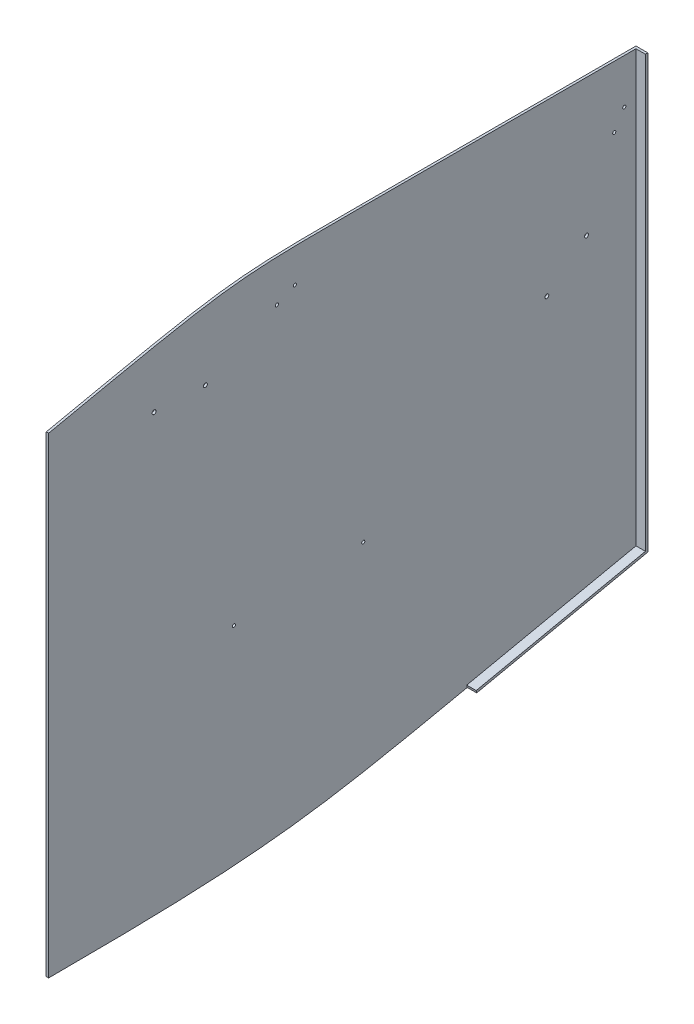
ISO-10303-21;
HEADER;
FILE_DESCRIPTION(('STEP AP214'),'2;1');
FILE_NAME('part.step','',(''),(''),'','','');
FILE_SCHEMA(('AUTOMOTIVE_DESIGN { 1 0 10303 214 1 1 1 1 }'));
ENDSEC;
DATA;
#1=APPLICATION_CONTEXT('core data for automotive mechanical design processes');
#2=APPLICATION_PROTOCOL_DEFINITION('international standard','automotive_design',2000,#1);
#3=PRODUCT_CONTEXT('',#1,'mechanical');
#4=PRODUCT('Part','Part','',(#3));
#5=PRODUCT_RELATED_PRODUCT_CATEGORY('part','',(#4));
#6=PRODUCT_DEFINITION_FORMATION('','',#4);
#7=PRODUCT_DEFINITION_CONTEXT('part definition',#1,'design');
#8=PRODUCT_DEFINITION('design','',#6,#7);
#9=PRODUCT_DEFINITION_SHAPE('','',#8);
#10=(LENGTH_UNIT() NAMED_UNIT(*) SI_UNIT(.MILLI.,.METRE.));
#11=(NAMED_UNIT(*) PLANE_ANGLE_UNIT() SI_UNIT($,.RADIAN.));
#12=(NAMED_UNIT(*) SI_UNIT($,.STERADIAN.) SOLID_ANGLE_UNIT());
#13=UNCERTAINTY_MEASURE_WITH_UNIT(LENGTH_MEASURE(1.E-05),#10,'distance_accuracy_value','');
#14=(GEOMETRIC_REPRESENTATION_CONTEXT(3) GLOBAL_UNCERTAINTY_ASSIGNED_CONTEXT((#13)) GLOBAL_UNIT_ASSIGNED_CONTEXT((#10,
#11,#12)) REPRESENTATION_CONTEXT('',''));
#15=CARTESIAN_POINT('',(0.,0.,0.));
#16=DIRECTION('',(0.,0.,1.));
#17=DIRECTION('',(1.,0.,0.));
#18=AXIS2_PLACEMENT_3D('',#15,#16,#17);
#19=CARTESIAN_POINT('',(0.,319.838635526176,150.465133654487));
#20=DIRECTION('',(-1.,0.,0.));
#21=DIRECTION('',(0.,0.,1.));
#22=AXIS2_PLACEMENT_3D('',#19,#20,#21);
#23=PLANE('',#22);
#24=CARTESIAN_POINT('',(0.,232.178083694992,240.980976375255));
#25=DIRECTION('',(-1.,0.,0.));
#26=DIRECTION('',(0.,0.,1.));
#27=AXIS2_PLACEMENT_3D('',#24,#25,#26);
#28=CIRCLE('',#27,2.49999999999993);
#29=CARTESIAN_POINT('',(0.,232.178083694992,243.480976375255));
#30=VERTEX_POINT('',#29);
#31=EDGE_CURVE('E222',#30,#30,#28,.T.);
#32=ORIENTED_EDGE('',*,*,#31,.T.);
#33=EDGE_LOOP('',(#32));
#34=FACE_BOUND('',#33,.T.);
#35=CARTESIAN_POINT('',(0.,151.668432326628,-309.057260955756));
#36=DIRECTION('',(-1.,0.,0.));
#37=DIRECTION('',(0.,0.,1.));
#38=AXIS2_PLACEMENT_3D('',#35,#36,#37);
#39=CIRCLE('',#38,2.49999999999996);
#40=CARTESIAN_POINT('',(0.,151.668432326628,-306.557260955756));
#41=VERTEX_POINT('',#40);
#42=EDGE_CURVE('E306',#41,#41,#39,.T.);
#43=ORIENTED_EDGE('',*,*,#42,.T.);
#44=EDGE_LOOP('',(#43));
#45=FACE_BOUND('',#44,.T.);
#46=CARTESIAN_POINT('',(0.,247.678292182664,-344.33236996464));
#47=DIRECTION('',(-1.,0.,0.));
#48=DIRECTION('',(0.,0.,1.));
#49=AXIS2_PLACEMENT_3D('',#46,#47,#48);
#50=CIRCLE('',#49,2.);
#51=CARTESIAN_POINT('',(0.,247.678292182664,-342.33236996464));
#52=VERTEX_POINT('',#51);
#53=EDGE_CURVE('E303',#52,#52,#50,.T.);
#54=ORIENTED_EDGE('',*,*,#53,.T.);
#55=EDGE_LOOP('',(#54));
#56=FACE_BOUND('',#55,.T.);
#57=CARTESIAN_POINT('',(0.,269.230000887089,-357.015369170463));
#58=DIRECTION('',(-1.,0.,0.));
#59=DIRECTION('',(0.,0.,1.));
#60=AXIS2_PLACEMENT_3D('',#57,#58,#59);
#61=CIRCLE('',#60,2.);
#62=CARTESIAN_POINT('',(0.,269.230000887089,-355.015369170463));
#63=VERTEX_POINT('',#62);
#64=EDGE_CURVE('E294',#63,#63,#61,.T.);
#65=ORIENTED_EDGE('',*,*,#64,.T.);
#66=EDGE_LOOP('',(#65));
#67=FACE_BOUND('',#66,.T.);
#68=CARTESIAN_POINT('',(0.,-53.6769549320207,139.344950951392));
#69=DIRECTION('',(-1.,0.,0.));
#70=DIRECTION('',(0.,0.,1.));
#71=AXIS2_PLACEMENT_3D('',#68,#69,#70);
#72=CIRCLE('',#71,2.);
#73=CARTESIAN_POINT('',(0.,-53.6769549320207,141.344950951392));
#74=VERTEX_POINT('',#73);
#75=EDGE_CURVE('E290',#74,#74,#72,.T.);
#76=ORIENTED_EDGE('',*,*,#75,.T.);
#77=EDGE_LOOP('',(#76));
#78=FACE_BOUND('',#77,.T.);
#79=CARTESIAN_POINT('',(0.,110.126241652456,-258.59120412079));
#80=DIRECTION('',(-1.,0.,0.));
#81=DIRECTION('',(0.,0.,1.));
#82=AXIS2_PLACEMENT_3D('',#79,#80,#81);
#83=CIRCLE('',#82,2.49999999999985);
#84=CARTESIAN_POINT('',(0.,110.126241652456,-256.09120412079));
#85=VERTEX_POINT('',#84);
#86=EDGE_CURVE('E288',#85,#85,#83,.T.);
#87=ORIENTED_EDGE('',*,*,#86,.T.);
#88=EDGE_LOOP('',(#87));
#89=FACE_BOUND('',#88,.T.);
#90=CARTESIAN_POINT('',(0.,282.615467422992,61.9187014503996));
#91=DIRECTION('',(-1.,0.,0.));
#92=DIRECTION('',(0.,0.,1.));
#93=AXIS2_PLACEMENT_3D('',#90,#91,#92);
#94=CIRCLE('',#93,2.);
#95=CARTESIAN_POINT('',(0.,282.615467422992,63.9187014503996));
#96=VERTEX_POINT('',#95);
#97=EDGE_CURVE('E291',#96,#96,#94,.T.);
#98=ORIENTED_EDGE('',*,*,#97,.T.);
#99=EDGE_LOOP('',(#98));
#100=FACE_BOUND('',#99,.T.);
#101=CARTESIAN_POINT('',(0.,272.236010662539,84.6695584516908));
#102=DIRECTION('',(-1.,0.,0.));
#103=DIRECTION('',(0.,0.,1.));
#104=AXIS2_PLACEMENT_3D('',#101,#102,#103);
#105=CIRCLE('',#104,2.);
#106=CARTESIAN_POINT('',(0.,272.236010662539,86.6695584516908));
#107=VERTEX_POINT('',#106);
#108=EDGE_CURVE('E297',#107,#107,#105,.T.);
#109=ORIENTED_EDGE('',*,*,#108,.T.);
#110=EDGE_LOOP('',(#109));
#111=FACE_BOUND('',#110,.T.);
#112=CARTESIAN_POINT('',(0.,229.281564523231,175.680236140806));
#113=DIRECTION('',(-1.,0.,0.));
#114=DIRECTION('',(0.,0.,1.));
#115=AXIS2_PLACEMENT_3D('',#112,#113,#114);
#116=CIRCLE('',#115,2.49999999999993);
#117=CARTESIAN_POINT('',(0.,229.281564523231,178.180236140806));
#118=VERTEX_POINT('',#117);
#119=EDGE_CURVE('E328',#118,#118,#116,.T.);
#120=ORIENTED_EDGE('',*,*,#119,.T.);
#121=EDGE_LOOP('',(#120));
#122=FACE_BOUND('',#121,.T.);
#123=CARTESIAN_POINT('',(0.,-44.0173953899926,-25.083553444382));
#124=DIRECTION('',(-1.,0.,0.));
#125=DIRECTION('',(0.,0.,1.));
#126=AXIS2_PLACEMENT_3D('',#123,#124,#125);
#127=CIRCLE('',#126,2.);
#128=CARTESIAN_POINT('',(0.,-44.0173953899926,-23.083553444382));
#129=VERTEX_POINT('',#128);
#130=EDGE_CURVE('E331',#129,#129,#127,.T.);
#131=ORIENTED_EDGE('',*,*,#130,.T.);
#132=EDGE_LOOP('',(#131));
#133=FACE_BOUND('',#132,.T.);
#134=DIRECTION('',(0.,-0.978147600733807,-0.207911690817752));
#135=VECTOR('',#134,1.);
#136=CARTESIAN_POINT('',(0.,-267.22352209705,-156.725041200941));
#137=LINE('',#136,#135);
#138=CARTESIAN_POINT('',(0.,-267.22352209705,-156.725041200941));
#139=VERTEX_POINT('',#138);
#140=CARTESIAN_POINT('',(0.,-270.157964899251,-157.348776273394));
#141=VERTEX_POINT('',#140);
#142=EDGE_CURVE('E50',#139,#141,#137,.T.);
#143=ORIENTED_EDGE('',*,*,#142,.F.);
#144=DIRECTION('',(0.,-0.207911690817753,0.978147600733807));
#145=VECTOR('',#144,1.);
#146=CARTESIAN_POINT('',(0.,-267.22352209705,-156.725041200941));
#147=LINE('',#146,#145);
#148=CARTESIAN_POINT('',(0.,-221.482012374239,-371.921925095885));
#149=VERTEX_POINT('',#148);
#150=EDGE_CURVE('E129',#149,#139,#147,.T.);
#151=ORIENTED_EDGE('',*,*,#150,.F.);
#152=DIRECTION('',(0.,-1.,0.));
#153=VECTOR('',#152,1.);
#154=CARTESIAN_POINT('',(0.,-221.482012374239,-371.921925095885));
#155=LINE('',#154,#153);
#156=CARTESIAN_POINT('',(0.,326.088635526176,-371.921925095885));
#157=VERTEX_POINT('',#156);
#158=EDGE_CURVE('E56',#157,#149,#155,.T.);
#159=ORIENTED_EDGE('',*,*,#158,.F.);
#160=DIRECTION('',(0.,0.,1.));
#161=VECTOR('',#160,1.);
#162=CARTESIAN_POINT('',(0.,326.088635526176,-24.9219250958854));
#163=LINE('',#162,#161);
#164=CARTESIAN_POINT('',(0.,326.088635526176,-24.9219250958854));
#165=VERTEX_POINT('',#164);
#166=EDGE_CURVE('E149',#157,#165,#163,.T.);
#167=ORIENTED_EDGE('',*,*,#166,.T.);
#168=CARTESIAN_POINT('',(0.,326.088635526176,-24.9219250958854));
#169=CARTESIAN_POINT('',(0.,326.088635526176,144.675070379029));
#170=CARTESIAN_POINT('',(0.,326.088635526176,139.846569430193));
#171=CARTESIAN_POINT('',(0.,276.088635526176,375.078074904115));
#172=B_SPLINE_CURVE_WITH_KNOTS('',3,(#168,#169,#170,#171),.UNSPECIFIED.,.F.,.F.,(4,4),(0.,1.),.UNSPECIFIED.);
#173=CARTESIAN_POINT('',(0.,276.088635526176,375.078074904115));
#174=VERTEX_POINT('',#173);
#175=EDGE_CURVE('E132',#165,#174,#172,.T.);
#176=ORIENTED_EDGE('',*,*,#175,.T.);
#177=DIRECTION('',(0.,-1.,0.));
#178=VECTOR('',#177,1.);
#179=CARTESIAN_POINT('',(0.,276.088635526176,375.078074904115));
#180=LINE('',#179,#178);
#181=CARTESIAN_POINT('',(0.,-323.911364473824,375.078074904115));
#182=VERTEX_POINT('',#181);
#183=EDGE_CURVE('E136',#174,#182,#180,.T.);
#184=ORIENTED_EDGE('',*,*,#183,.T.);
#185=CARTESIAN_POINT('',(0.,-323.911364473824,375.078074904115));
#186=CARTESIAN_POINT('',(0.,-323.911364473824,95.5410858519753));
#187=CARTESIAN_POINT('',(0.,-311.056240073541,35.0624805373112));
#188=CARTESIAN_POINT('',(0.,-270.157964899251,-157.348776273394));
#189=B_SPLINE_CURVE_WITH_KNOTS('',3,(#185,#186,#187,#188),.UNSPECIFIED.,.F.,.F.,(4,4),(0.,1.),.UNSPECIFIED.);
#190=EDGE_CURVE('E388',#182,#141,#189,.T.);
#191=ORIENTED_EDGE('',*,*,#190,.T.);
#192=EDGE_LOOP('',(#143,#151,#159,#167,#176,#184,#191));
#193=FACE_BOUND('',#192,.T.);
#194=ADVANCED_FACE('F32',(#34,#45,#56,#67,#78,#89,#100,#111,#122,#133,#193),#23,.F.);
#195=CARTESIAN_POINT('',(-3.,326.088635526176,-24.9219250958854));
#196=CARTESIAN_POINT('',(-3.,326.088635526176,144.675070379029));
#197=CARTESIAN_POINT('',(-3.,326.088635526176,139.846569430193));
#198=CARTESIAN_POINT('',(-3.,276.088635526176,375.078074904115));
#199=B_SPLINE_CURVE_WITH_KNOTS('',3,(#195,#196,#197,#198),.UNSPECIFIED.,.F.,.F.,(4,4),(0.,1.),.UNSPECIFIED.);
#200=DIRECTION('',(1.,0.,0.));
#201=VECTOR('',#200,1.);
#202=SURFACE_OF_LINEAR_EXTRUSION('',#199,#201);
#203=ORIENTED_EDGE('',*,*,#175,.F.);
#204=DIRECTION('',(1.,0.,0.));
#205=VECTOR('',#204,1.);
#206=CARTESIAN_POINT('',(-3.,326.088635526176,-24.9219250958854));
#207=LINE('',#206,#205);
#208=CARTESIAN_POINT('',(-3.,326.088635526176,-24.9219250958854));
#209=VERTEX_POINT('',#208);
#210=EDGE_CURVE('E11',#209,#165,#207,.T.);
#211=ORIENTED_EDGE('',*,*,#210,.F.);
#212=CARTESIAN_POINT('',(-3.,276.088635526176,375.078074904115));
#213=VERTEX_POINT('',#212);
#214=EDGE_CURVE('E142',#209,#213,#199,.T.);
#215=ORIENTED_EDGE('',*,*,#214,.T.);
#216=DIRECTION('',(1.,0.,0.));
#217=VECTOR('',#216,1.);
#218=CARTESIAN_POINT('',(-3.,276.088635526176,375.078074904115));
#219=LINE('',#218,#217);
#220=EDGE_CURVE('E37',#213,#174,#219,.T.);
#221=ORIENTED_EDGE('',*,*,#220,.T.);
#222=EDGE_LOOP('',(#203,#211,#215,#221));
#223=FACE_BOUND('',#222,.T.);
#224=ADVANCED_FACE('F34',(#223),#202,.T.);
#225=CARTESIAN_POINT('',(-3.,326.088635526176,-24.9219250958854));
#226=DIRECTION('',(0.,1.,0.));
#227=DIRECTION('',(0.,0.,1.));
#228=AXIS2_PLACEMENT_3D('',#225,#226,#227);
#229=PLANE('',#228);
#230=ORIENTED_EDGE('',*,*,#166,.F.);
#231=DIRECTION('',(-1.,0.,0.));
#232=VECTOR('',#231,1.);
#233=CARTESIAN_POINT('',(12.,326.088635526176,-371.921925095885));
#234=LINE('',#233,#232);
#235=CARTESIAN_POINT('',(12.,326.088635526176,-371.921925095885));
#236=VERTEX_POINT('',#235);
#237=EDGE_CURVE('E133',#236,#157,#234,.T.);
#238=ORIENTED_EDGE('',*,*,#237,.F.);
#239=DIRECTION('',(0.,0.,1.));
#240=VECTOR('',#239,1.);
#241=CARTESIAN_POINT('',(12.,326.088635526176,-371.921925095885));
#242=LINE('',#241,#240);
#243=CARTESIAN_POINT('',(12.,326.088635526176,-374.921925095885));
#244=VERTEX_POINT('',#243);
#245=EDGE_CURVE('E211',#244,#236,#242,.T.);
#246=ORIENTED_EDGE('',*,*,#245,.F.);
#247=DIRECTION('',(1.,0.,0.));
#248=VECTOR('',#247,1.);
#249=CARTESIAN_POINT('',(-3.,326.088635526176,-374.921925095885));
#250=LINE('',#249,#248);
#251=CARTESIAN_POINT('',(-3.,326.088635526176,-374.921925095885));
#252=VERTEX_POINT('',#251);
#253=EDGE_CURVE('E42',#252,#244,#250,.T.);
#254=ORIENTED_EDGE('',*,*,#253,.F.);
#255=DIRECTION('',(0.,0.,1.));
#256=VECTOR('',#255,1.);
#257=CARTESIAN_POINT('',(-3.,326.088635526176,-24.9219250958854));
#258=LINE('',#257,#256);
#259=EDGE_CURVE('E375',#252,#209,#258,.T.);
#260=ORIENTED_EDGE('',*,*,#259,.T.);
#261=ORIENTED_EDGE('',*,*,#210,.T.);
#262=EDGE_LOOP('',(#230,#238,#246,#254,#260,#261));
#263=FACE_BOUND('',#262,.T.);
#264=ADVANCED_FACE('F190',(#263),#229,.T.);
#265=CARTESIAN_POINT('',(-3.,326.088635526176,-374.921925095885));
#266=DIRECTION('',(0.,0.,-1.));
#267=DIRECTION('',(0.,1.,0.));
#268=AXIS2_PLACEMENT_3D('',#265,#266,#267);
#269=PLANE('',#268);
#270=ORIENTED_EDGE('',*,*,#253,.T.);
#271=DIRECTION('',(0.,1.,0.));
#272=VECTOR('',#271,1.);
#273=CARTESIAN_POINT('',(12.,-223.911364473824,-374.921925095885));
#274=LINE('',#273,#272);
#275=CARTESIAN_POINT('',(12.,-223.911364473824,-374.921925095885));
#276=VERTEX_POINT('',#275);
#277=EDGE_CURVE('E119',#276,#244,#274,.T.);
#278=ORIENTED_EDGE('',*,*,#277,.F.);
#279=DIRECTION('',(1.,0.,0.));
#280=VECTOR('',#279,1.);
#281=CARTESIAN_POINT('',(-3.,-223.911364473824,-374.921925095885));
#282=LINE('',#281,#280);
#283=CARTESIAN_POINT('',(-3.,-223.911364473824,-374.921925095885));
#284=VERTEX_POINT('',#283);
#285=EDGE_CURVE('E115',#284,#276,#282,.T.);
#286=ORIENTED_EDGE('',*,*,#285,.F.);
#287=DIRECTION('',(0.,1.,0.));
#288=VECTOR('',#287,1.);
#289=CARTESIAN_POINT('',(-3.,326.088635526176,-374.921925095885));
#290=LINE('',#289,#288);
#291=EDGE_CURVE('E206',#284,#252,#290,.T.);
#292=ORIENTED_EDGE('',*,*,#291,.T.);
#293=EDGE_LOOP('',(#270,#278,#286,#292));
#294=FACE_BOUND('',#293,.T.);
#295=ADVANCED_FACE('F197',(#294),#269,.T.);
#296=CARTESIAN_POINT('',(-3.,-223.911364473824,-374.921925095885));
#297=DIRECTION('',(0.,-0.978147600733807,-0.207911690817753));
#298=DIRECTION('',(0.,0.207911690817753,-0.978147600733807));
#299=AXIS2_PLACEMENT_3D('',#296,#297,#298);
#300=PLANE('',#299);
#301=ORIENTED_EDGE('',*,*,#285,.T.);
#302=DIRECTION('',(0.,0.207911690817753,-0.978147600733807));
#303=VECTOR('',#302,1.);
#304=CARTESIAN_POINT('',(12.,-270.157964899251,-157.348776273394));
#305=LINE('',#304,#303);
#306=CARTESIAN_POINT('',(12.,-270.157964899251,-157.348776273394));
#307=VERTEX_POINT('',#306);
#308=EDGE_CURVE('E109',#307,#276,#305,.T.);
#309=ORIENTED_EDGE('',*,*,#308,.F.);
#310=DIRECTION('',(-1.,0.,0.));
#311=VECTOR('',#310,1.);
#312=CARTESIAN_POINT('',(12.,-270.157964899251,-157.348776273394));
#313=LINE('',#312,#311);
#314=EDGE_CURVE('E113',#307,#141,#313,.T.);
#315=ORIENTED_EDGE('',*,*,#314,.T.);
#316=DIRECTION('',(1.,0.,0.));
#317=VECTOR('',#316,1.);
#318=CARTESIAN_POINT('',(-3.,-270.157964899251,-157.348776273394));
#319=LINE('',#318,#317);
#320=CARTESIAN_POINT('',(-3.,-270.157964899251,-157.348776273394));
#321=VERTEX_POINT('',#320);
#322=EDGE_CURVE('E397',#321,#141,#319,.T.);
#323=ORIENTED_EDGE('',*,*,#322,.F.);
#324=DIRECTION('',(0.,0.207911690817753,-0.978147600733807));
#325=VECTOR('',#324,1.);
#326=CARTESIAN_POINT('',(-3.,-223.911364473824,-374.921925095885));
#327=LINE('',#326,#325);
#328=EDGE_CURVE('E161',#321,#284,#327,.T.);
#329=ORIENTED_EDGE('',*,*,#328,.T.);
#330=EDGE_LOOP('',(#301,#309,#315,#323,#329));
#331=FACE_BOUND('',#330,.T.);
#332=ADVANCED_FACE('F111',(#331),#300,.T.);
#333=CARTESIAN_POINT('',(-3.,-323.911364473824,375.078074904115));
#334=CARTESIAN_POINT('',(-3.,-323.911364473824,95.5410858519753));
#335=CARTESIAN_POINT('',(-3.,-311.056240073541,35.0624805373112));
#336=CARTESIAN_POINT('',(-3.,-270.157964899251,-157.348776273394));
#337=B_SPLINE_CURVE_WITH_KNOTS('',3,(#333,#334,#335,#336),.UNSPECIFIED.,.F.,.F.,(4,4),(0.,1.),.UNSPECIFIED.);
#338=DIRECTION('',(1.,0.,0.));
#339=VECTOR('',#338,1.);
#340=SURFACE_OF_LINEAR_EXTRUSION('',#337,#339);
#341=ORIENTED_EDGE('',*,*,#190,.F.);
#342=DIRECTION('',(1.,0.,0.));
#343=VECTOR('',#342,1.);
#344=CARTESIAN_POINT('',(-3.,-323.911364473824,375.078074904115));
#345=LINE('',#344,#343);
#346=CARTESIAN_POINT('',(-3.,-323.911364473824,375.078074904115));
#347=VERTEX_POINT('',#346);
#348=EDGE_CURVE('E379',#347,#182,#345,.T.);
#349=ORIENTED_EDGE('',*,*,#348,.F.);
#350=EDGE_CURVE('E155',#347,#321,#337,.T.);
#351=ORIENTED_EDGE('',*,*,#350,.T.);
#352=ORIENTED_EDGE('',*,*,#322,.T.);
#353=EDGE_LOOP('',(#341,#349,#351,#352));
#354=FACE_BOUND('',#353,.T.);
#355=ADVANCED_FACE('F167',(#354),#340,.T.);
#356=CARTESIAN_POINT('',(-3.,276.088635526176,375.078074904115));
#357=DIRECTION('',(0.,0.,1.));
#358=DIRECTION('',(1.,0.,0.));
#359=AXIS2_PLACEMENT_3D('',#356,#357,#358);
#360=PLANE('',#359);
#361=ORIENTED_EDGE('',*,*,#183,.F.);
#362=ORIENTED_EDGE('',*,*,#220,.F.);
#363=DIRECTION('',(0.,-1.,0.));
#364=VECTOR('',#363,1.);
#365=CARTESIAN_POINT('',(-3.,276.088635526176,375.078074904115));
#366=LINE('',#365,#364);
#367=EDGE_CURVE('E148',#213,#347,#366,.T.);
#368=ORIENTED_EDGE('',*,*,#367,.T.);
#369=ORIENTED_EDGE('',*,*,#348,.T.);
#370=EDGE_LOOP('',(#361,#362,#368,#369));
#371=FACE_BOUND('',#370,.T.);
#372=ADVANCED_FACE('F170',(#371),#360,.T.);
#373=CARTESIAN_POINT('',(-3.,319.838635526176,150.465133654487));
#374=DIRECTION('',(-1.,0.,0.));
#375=DIRECTION('',(0.,0.,1.));
#376=AXIS2_PLACEMENT_3D('',#373,#374,#375);
#377=PLANE('',#376);
#378=CARTESIAN_POINT('',(-3.,232.178083694992,240.980976375255));
#379=DIRECTION('',(1.,0.,0.));
#380=DIRECTION('',(0.,0.,-1.));
#381=AXIS2_PLACEMENT_3D('',#378,#379,#380);
#382=CIRCLE('',#381,2.49999999999993);
#383=CARTESIAN_POINT('',(-3.,232.178083694992,238.480976375255));
#384=VERTEX_POINT('',#383);
#385=EDGE_CURVE('E340',#384,#384,#382,.T.);
#386=ORIENTED_EDGE('',*,*,#385,.T.);
#387=EDGE_LOOP('',(#386));
#388=FACE_BOUND('',#387,.T.);
#389=CARTESIAN_POINT('',(-3.,151.668432326628,-309.057260955756));
#390=DIRECTION('',(1.,0.,0.));
#391=DIRECTION('',(0.,0.,-1.));
#392=AXIS2_PLACEMENT_3D('',#389,#390,#391);
#393=CIRCLE('',#392,2.49999999999996);
#394=CARTESIAN_POINT('',(-3.,151.668432326628,-311.557260955756));
#395=VERTEX_POINT('',#394);
#396=EDGE_CURVE('E350',#395,#395,#393,.T.);
#397=ORIENTED_EDGE('',*,*,#396,.T.);
#398=EDGE_LOOP('',(#397));
#399=FACE_BOUND('',#398,.T.);
#400=CARTESIAN_POINT('',(-3.,247.678292182664,-344.33236996464));
#401=DIRECTION('',(1.,0.,0.));
#402=DIRECTION('',(0.,0.,-1.));
#403=AXIS2_PLACEMENT_3D('',#400,#401,#402);
#404=CIRCLE('',#403,2.);
#405=CARTESIAN_POINT('',(-3.,247.678292182664,-346.33236996464));
#406=VERTEX_POINT('',#405);
#407=EDGE_CURVE('E347',#406,#406,#404,.T.);
#408=ORIENTED_EDGE('',*,*,#407,.T.);
#409=EDGE_LOOP('',(#408));
#410=FACE_BOUND('',#409,.T.);
#411=CARTESIAN_POINT('',(-3.,269.230000887089,-357.015369170463));
#412=DIRECTION('',(1.,0.,0.));
#413=DIRECTION('',(0.,0.,-1.));
#414=AXIS2_PLACEMENT_3D('',#411,#412,#413);
#415=CIRCLE('',#414,2.);
#416=CARTESIAN_POINT('',(-3.,269.230000887089,-359.015369170463));
#417=VERTEX_POINT('',#416);
#418=EDGE_CURVE('E344',#417,#417,#415,.T.);
#419=ORIENTED_EDGE('',*,*,#418,.T.);
#420=EDGE_LOOP('',(#419));
#421=FACE_BOUND('',#420,.T.);
#422=CARTESIAN_POINT('',(-3.,-53.6769549320207,139.344950951392));
#423=DIRECTION('',(1.,0.,0.));
#424=DIRECTION('',(0.,0.,-1.));
#425=AXIS2_PLACEMENT_3D('',#422,#423,#424);
#426=CIRCLE('',#425,2.);
#427=CARTESIAN_POINT('',(-3.,-53.6769549320207,137.344950951392));
#428=VERTEX_POINT('',#427);
#429=EDGE_CURVE('E337',#428,#428,#426,.T.);
#430=ORIENTED_EDGE('',*,*,#429,.T.);
#431=EDGE_LOOP('',(#430));
#432=FACE_BOUND('',#431,.T.);
#433=CARTESIAN_POINT('',(-3.,110.126241652456,-258.59120412079));
#434=DIRECTION('',(1.,0.,0.));
#435=DIRECTION('',(0.,0.,-1.));
#436=AXIS2_PLACEMENT_3D('',#433,#434,#435);
#437=CIRCLE('',#436,2.49999999999985);
#438=CARTESIAN_POINT('',(-3.,110.126241652456,-261.091204120789));
#439=VERTEX_POINT('',#438);
#440=EDGE_CURVE('E285',#439,#439,#437,.T.);
#441=ORIENTED_EDGE('',*,*,#440,.T.);
#442=EDGE_LOOP('',(#441));
#443=FACE_BOUND('',#442,.T.);
#444=CARTESIAN_POINT('',(-3.,282.615467422992,61.9187014503996));
#445=DIRECTION('',(1.,0.,0.));
#446=DIRECTION('',(0.,0.,-1.));
#447=AXIS2_PLACEMENT_3D('',#444,#445,#446);
#448=CIRCLE('',#447,2.);
#449=CARTESIAN_POINT('',(-3.,282.615467422992,59.9187014503996));
#450=VERTEX_POINT('',#449);
#451=EDGE_CURVE('E360',#450,#450,#448,.T.);
#452=ORIENTED_EDGE('',*,*,#451,.T.);
#453=EDGE_LOOP('',(#452));
#454=FACE_BOUND('',#453,.T.);
#455=CARTESIAN_POINT('',(-3.,272.236010662539,84.6695584516908));
#456=DIRECTION('',(1.,0.,0.));
#457=DIRECTION('',(0.,0.,-1.));
#458=AXIS2_PLACEMENT_3D('',#455,#456,#457);
#459=CIRCLE('',#458,2.);
#460=CARTESIAN_POINT('',(-3.,272.236010662539,82.6695584516908));
#461=VERTEX_POINT('',#460);
#462=EDGE_CURVE('E357',#461,#461,#459,.T.);
#463=ORIENTED_EDGE('',*,*,#462,.T.);
#464=EDGE_LOOP('',(#463));
#465=FACE_BOUND('',#464,.T.);
#466=CARTESIAN_POINT('',(-3.,229.281564523231,175.680236140806));
#467=DIRECTION('',(1.,0.,0.));
#468=DIRECTION('',(0.,0.,-1.));
#469=AXIS2_PLACEMENT_3D('',#466,#467,#468);
#470=CIRCLE('',#469,2.49999999999993);
#471=CARTESIAN_POINT('',(-3.,229.281564523231,173.180236140806));
#472=VERTEX_POINT('',#471);
#473=EDGE_CURVE('E343',#472,#472,#470,.T.);
#474=ORIENTED_EDGE('',*,*,#473,.T.);
#475=EDGE_LOOP('',(#474));
#476=FACE_BOUND('',#475,.T.);
#477=CARTESIAN_POINT('',(-3.,-44.0173953899926,-25.083553444382));
#478=DIRECTION('',(1.,0.,0.));
#479=DIRECTION('',(0.,0.,-1.));
#480=AXIS2_PLACEMENT_3D('',#477,#478,#479);
#481=CIRCLE('',#480,2.);
#482=CARTESIAN_POINT('',(-3.,-44.0173953899926,-27.083553444382));
#483=VERTEX_POINT('',#482);
#484=EDGE_CURVE('E333',#483,#483,#481,.T.);
#485=ORIENTED_EDGE('',*,*,#484,.T.);
#486=EDGE_LOOP('',(#485));
#487=FACE_BOUND('',#486,.T.);
#488=ORIENTED_EDGE('',*,*,#214,.F.);
#489=ORIENTED_EDGE('',*,*,#259,.F.);
#490=ORIENTED_EDGE('',*,*,#291,.F.);
#491=ORIENTED_EDGE('',*,*,#328,.F.);
#492=ORIENTED_EDGE('',*,*,#350,.F.);
#493=ORIENTED_EDGE('',*,*,#367,.F.);
#494=EDGE_LOOP('',(#488,#489,#490,#491,#492,#493));
#495=FACE_BOUND('',#494,.T.);
#496=ADVANCED_FACE('F174',(#388,#399,#410,#421,#432,#443,#454,#465,#476,#487,#495),#377,.T.);
#497=CARTESIAN_POINT('',(12.,-267.22352209705,-156.725041200941));
#498=DIRECTION('',(0.,0.207911690817752,-0.978147600733807));
#499=DIRECTION('',(0.,0.978147600733807,0.207911690817752));
#500=AXIS2_PLACEMENT_3D('',#497,#498,#499);
#501=PLANE('',#500);
#502=ORIENTED_EDGE('',*,*,#142,.T.);
#503=ORIENTED_EDGE('',*,*,#314,.F.);
#504=DIRECTION('',(0.,-0.978147600733807,-0.207911690817752));
#505=VECTOR('',#504,1.);
#506=CARTESIAN_POINT('',(12.,-267.22352209705,-156.725041200941));
#507=LINE('',#506,#505);
#508=CARTESIAN_POINT('',(12.,-267.22352209705,-156.725041200941));
#509=VERTEX_POINT('',#508);
#510=EDGE_CURVE('E120',#509,#307,#507,.T.);
#511=ORIENTED_EDGE('',*,*,#510,.F.);
#512=DIRECTION('',(-1.,0.,0.));
#513=VECTOR('',#512,1.);
#514=CARTESIAN_POINT('',(12.,-267.22352209705,-156.725041200941));
#515=LINE('',#514,#513);
#516=EDGE_CURVE('E220',#509,#139,#515,.T.);
#517=ORIENTED_EDGE('',*,*,#516,.T.);
#518=EDGE_LOOP('',(#502,#503,#511,#517));
#519=FACE_BOUND('',#518,.T.);
#520=ADVANCED_FACE('F131',(#519),#501,.F.);
#521=CARTESIAN_POINT('',(12.,-221.482012374239,-371.921925095885));
#522=DIRECTION('',(0.,0.,-1.));
#523=DIRECTION('',(-1.,0.,0.));
#524=AXIS2_PLACEMENT_3D('',#521,#522,#523);
#525=PLANE('',#524);
#526=ORIENTED_EDGE('',*,*,#158,.T.);
#527=DIRECTION('',(-1.,0.,0.));
#528=VECTOR('',#527,1.);
#529=CARTESIAN_POINT('',(12.,-221.482012374239,-371.921925095885));
#530=LINE('',#529,#528);
#531=CARTESIAN_POINT('',(12.,-221.482012374239,-371.921925095885));
#532=VERTEX_POINT('',#531);
#533=EDGE_CURVE('E139',#532,#149,#530,.T.);
#534=ORIENTED_EDGE('',*,*,#533,.F.);
#535=DIRECTION('',(0.,-1.,0.));
#536=VECTOR('',#535,1.);
#537=CARTESIAN_POINT('',(12.,-221.482012374239,-371.921925095885));
#538=LINE('',#537,#536);
#539=EDGE_CURVE('E215',#236,#532,#538,.T.);
#540=ORIENTED_EDGE('',*,*,#539,.F.);
#541=ORIENTED_EDGE('',*,*,#237,.T.);
#542=EDGE_LOOP('',(#526,#534,#540,#541));
#543=FACE_BOUND('',#542,.T.);
#544=ADVANCED_FACE('F230',(#543),#525,.F.);
#545=CARTESIAN_POINT('',(12.,-267.22352209705,-156.725041200941));
#546=DIRECTION('',(0.,-0.978147600733807,-0.207911690817753));
#547=DIRECTION('',(0.,0.207911690817753,-0.978147600733807));
#548=AXIS2_PLACEMENT_3D('',#545,#546,#547);
#549=PLANE('',#548);
#550=ORIENTED_EDGE('',*,*,#150,.T.);
#551=ORIENTED_EDGE('',*,*,#516,.F.);
#552=DIRECTION('',(0.,-0.207911690817753,0.978147600733807));
#553=VECTOR('',#552,1.);
#554=CARTESIAN_POINT('',(12.,-267.22352209705,-156.725041200941));
#555=LINE('',#554,#553);
#556=EDGE_CURVE('E125',#532,#509,#555,.T.);
#557=ORIENTED_EDGE('',*,*,#556,.F.);
#558=ORIENTED_EDGE('',*,*,#533,.T.);
#559=EDGE_LOOP('',(#550,#551,#557,#558));
#560=FACE_BOUND('',#559,.T.);
#561=ADVANCED_FACE('F228',(#560),#549,.F.);
#562=CARTESIAN_POINT('',(12.,0.,0.));
#563=DIRECTION('',(1.,0.,0.));
#564=DIRECTION('',(0.,0.,-1.));
#565=AXIS2_PLACEMENT_3D('',#562,#563,#564);
#566=PLANE('',#565);
#567=ORIENTED_EDGE('',*,*,#510,.T.);
#568=ORIENTED_EDGE('',*,*,#308,.T.);
#569=ORIENTED_EDGE('',*,*,#277,.T.);
#570=ORIENTED_EDGE('',*,*,#245,.T.);
#571=ORIENTED_EDGE('',*,*,#539,.T.);
#572=ORIENTED_EDGE('',*,*,#556,.T.);
#573=EDGE_LOOP('',(#567,#568,#569,#570,#571,#572));
#574=FACE_BOUND('',#573,.T.);
#575=ADVANCED_FACE('F123',(#574),#566,.T.);
#576=CARTESIAN_POINT('',(-3.,-44.0173953899926,-25.083553444382));
#577=DIRECTION('',(1.,0.,0.));
#578=DIRECTION('',(0.,0.,-1.));
#579=AXIS2_PLACEMENT_3D('',#576,#577,#578);
#580=CYLINDRICAL_SURFACE('',#579,2.);
#581=ORIENTED_EDGE('',*,*,#484,.F.);
#582=EDGE_LOOP('',(#581));
#583=FACE_BOUND('',#582,.T.);
#584=ORIENTED_EDGE('',*,*,#130,.F.);
#585=EDGE_LOOP('',(#584));
#586=FACE_BOUND('',#585,.T.);
#587=ADVANCED_FACE('F241',(#583,#586),#580,.F.);
#588=CARTESIAN_POINT('',(-3.,229.281564523231,175.680236140806));
#589=DIRECTION('',(1.,0.,0.));
#590=DIRECTION('',(0.,0.,-1.));
#591=AXIS2_PLACEMENT_3D('',#588,#589,#590);
#592=CYLINDRICAL_SURFACE('',#591,2.49999999999993);
#593=ORIENTED_EDGE('',*,*,#473,.F.);
#594=EDGE_LOOP('',(#593));
#595=FACE_BOUND('',#594,.T.);
#596=ORIENTED_EDGE('',*,*,#119,.F.);
#597=EDGE_LOOP('',(#596));
#598=FACE_BOUND('',#597,.T.);
#599=ADVANCED_FACE('F244',(#595,#598),#592,.F.);
#600=CARTESIAN_POINT('',(-3.,272.236010662539,84.6695584516908));
#601=DIRECTION('',(1.,0.,0.));
#602=DIRECTION('',(0.,0.,-1.));
#603=AXIS2_PLACEMENT_3D('',#600,#601,#602);
#604=CYLINDRICAL_SURFACE('',#603,2.);
#605=ORIENTED_EDGE('',*,*,#462,.F.);
#606=EDGE_LOOP('',(#605));
#607=FACE_BOUND('',#606,.T.);
#608=ORIENTED_EDGE('',*,*,#108,.F.);
#609=EDGE_LOOP('',(#608));
#610=FACE_BOUND('',#609,.T.);
#611=ADVANCED_FACE('F269',(#607,#610),#604,.F.);
#612=CARTESIAN_POINT('',(-3.,282.615467422992,61.9187014503996));
#613=DIRECTION('',(1.,0.,0.));
#614=DIRECTION('',(0.,0.,-1.));
#615=AXIS2_PLACEMENT_3D('',#612,#613,#614);
#616=CYLINDRICAL_SURFACE('',#615,2.);
#617=ORIENTED_EDGE('',*,*,#451,.F.);
#618=EDGE_LOOP('',(#617));
#619=FACE_BOUND('',#618,.T.);
#620=ORIENTED_EDGE('',*,*,#97,.F.);
#621=EDGE_LOOP('',(#620));
#622=FACE_BOUND('',#621,.T.);
#623=ADVANCED_FACE('F273',(#619,#622),#616,.F.);
#624=CARTESIAN_POINT('',(-3.,110.126241652456,-258.59120412079));
#625=DIRECTION('',(1.,0.,0.));
#626=DIRECTION('',(0.,0.,-1.));
#627=AXIS2_PLACEMENT_3D('',#624,#625,#626);
#628=CYLINDRICAL_SURFACE('',#627,2.49999999999985);
#629=ORIENTED_EDGE('',*,*,#440,.F.);
#630=EDGE_LOOP('',(#629));
#631=FACE_BOUND('',#630,.T.);
#632=ORIENTED_EDGE('',*,*,#86,.F.);
#633=EDGE_LOOP('',(#632));
#634=FACE_BOUND('',#633,.T.);
#635=ADVANCED_FACE('F259',(#631,#634),#628,.F.);
#636=CARTESIAN_POINT('',(-3.,-53.6769549320207,139.344950951392));
#637=DIRECTION('',(1.,0.,0.));
#638=DIRECTION('',(0.,0.,-1.));
#639=AXIS2_PLACEMENT_3D('',#636,#637,#638);
#640=CYLINDRICAL_SURFACE('',#639,2.);
#641=ORIENTED_EDGE('',*,*,#429,.F.);
#642=EDGE_LOOP('',(#641));
#643=FACE_BOUND('',#642,.T.);
#644=ORIENTED_EDGE('',*,*,#75,.F.);
#645=EDGE_LOOP('',(#644));
#646=FACE_BOUND('',#645,.T.);
#647=ADVANCED_FACE('F255',(#643,#646),#640,.F.);
#648=CARTESIAN_POINT('',(-3.,269.230000887089,-357.015369170463));
#649=DIRECTION('',(1.,0.,0.));
#650=DIRECTION('',(0.,0.,-1.));
#651=AXIS2_PLACEMENT_3D('',#648,#649,#650);
#652=CYLINDRICAL_SURFACE('',#651,2.);
#653=ORIENTED_EDGE('',*,*,#418,.F.);
#654=EDGE_LOOP('',(#653));
#655=FACE_BOUND('',#654,.T.);
#656=ORIENTED_EDGE('',*,*,#64,.F.);
#657=EDGE_LOOP('',(#656));
#658=FACE_BOUND('',#657,.T.);
#659=ADVANCED_FACE('F251',(#655,#658),#652,.F.);
#660=CARTESIAN_POINT('',(-3.,247.678292182664,-344.33236996464));
#661=DIRECTION('',(1.,0.,0.));
#662=DIRECTION('',(0.,0.,-1.));
#663=AXIS2_PLACEMENT_3D('',#660,#661,#662);
#664=CYLINDRICAL_SURFACE('',#663,2.);
#665=ORIENTED_EDGE('',*,*,#407,.F.);
#666=EDGE_LOOP('',(#665));
#667=FACE_BOUND('',#666,.T.);
#668=ORIENTED_EDGE('',*,*,#53,.F.);
#669=EDGE_LOOP('',(#668));
#670=FACE_BOUND('',#669,.T.);
#671=ADVANCED_FACE('F254',(#667,#670),#664,.F.);
#672=CARTESIAN_POINT('',(-3.,151.668432326628,-309.057260955756));
#673=DIRECTION('',(1.,0.,0.));
#674=DIRECTION('',(0.,0.,-1.));
#675=AXIS2_PLACEMENT_3D('',#672,#673,#674);
#676=CYLINDRICAL_SURFACE('',#675,2.49999999999996);
#677=ORIENTED_EDGE('',*,*,#396,.F.);
#678=EDGE_LOOP('',(#677));
#679=FACE_BOUND('',#678,.T.);
#680=ORIENTED_EDGE('',*,*,#42,.F.);
#681=EDGE_LOOP('',(#680));
#682=FACE_BOUND('',#681,.T.);
#683=ADVANCED_FACE('F249',(#679,#682),#676,.F.);
#684=CARTESIAN_POINT('',(-3.,232.178083694992,240.980976375255));
#685=DIRECTION('',(1.,0.,0.));
#686=DIRECTION('',(0.,0.,-1.));
#687=AXIS2_PLACEMENT_3D('',#684,#685,#686);
#688=CYLINDRICAL_SURFACE('',#687,2.49999999999993);
#689=ORIENTED_EDGE('',*,*,#385,.F.);
#690=EDGE_LOOP('',(#689));
#691=FACE_BOUND('',#690,.T.);
#692=ORIENTED_EDGE('',*,*,#31,.F.);
#693=EDGE_LOOP('',(#692));
#694=FACE_BOUND('',#693,.T.);
#695=ADVANCED_FACE('F246',(#691,#694),#688,.F.);
#696=CLOSED_SHELL('',(#194,#224,#264,#295,#332,#355,#372,#496,#520,#544,#561,#575,#587,#599,
#611,#623,#635,#647,#659,#671,#683,#695));
#697=MANIFOLD_SOLID_BREP('B2',#696);
#698=ADVANCED_BREP_SHAPE_REPRESENTATION('',(#18,#697),#14);
#699=SHAPE_DEFINITION_REPRESENTATION(#9,#698);
ENDSEC;
END-ISO-10303-21;
